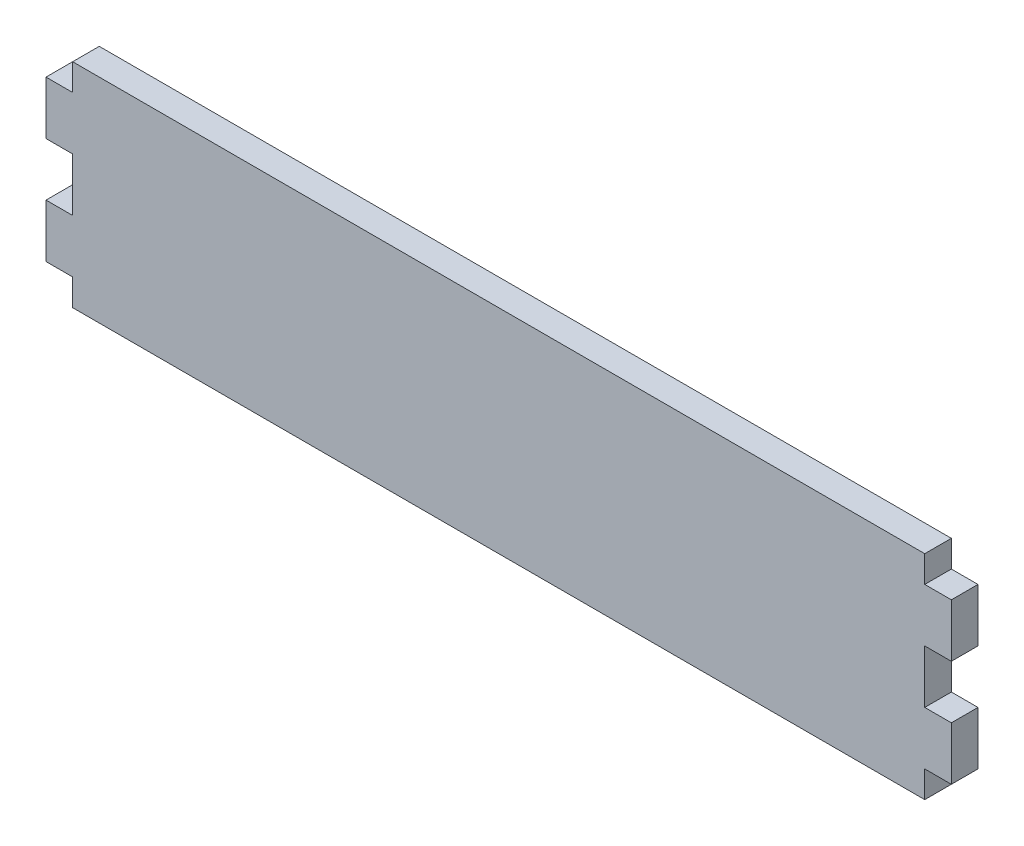
ISO-10303-21;
HEADER;
FILE_DESCRIPTION(('STEP AP214'),'2;1');
FILE_NAME('part.step','',(''),(''),'','','');
FILE_SCHEMA(('AUTOMOTIVE_DESIGN { 1 0 10303 214 1 1 1 1 }'));
ENDSEC;
DATA;
#1=APPLICATION_CONTEXT('core data for automotive mechanical design processes');
#2=APPLICATION_PROTOCOL_DEFINITION('international standard','automotive_design',2000,#1);
#3=PRODUCT_CONTEXT('',#1,'mechanical');
#4=PRODUCT('Part','Part','',(#3));
#5=PRODUCT_RELATED_PRODUCT_CATEGORY('part','',(#4));
#6=PRODUCT_DEFINITION_FORMATION('','',#4);
#7=PRODUCT_DEFINITION_CONTEXT('part definition',#1,'design');
#8=PRODUCT_DEFINITION('design','',#6,#7);
#9=PRODUCT_DEFINITION_SHAPE('','',#8);
#10=(LENGTH_UNIT() NAMED_UNIT(*) SI_UNIT(.MILLI.,.METRE.));
#11=(NAMED_UNIT(*) PLANE_ANGLE_UNIT() SI_UNIT($,.RADIAN.));
#12=(NAMED_UNIT(*) SI_UNIT($,.STERADIAN.) SOLID_ANGLE_UNIT());
#13=UNCERTAINTY_MEASURE_WITH_UNIT(LENGTH_MEASURE(1.E-05),#10,'distance_accuracy_value','');
#14=(GEOMETRIC_REPRESENTATION_CONTEXT(3) GLOBAL_UNCERTAINTY_ASSIGNED_CONTEXT((#13)) GLOBAL_UNIT_ASSIGNED_CONTEXT((#10,
#11,#12)) REPRESENTATION_CONTEXT('',''));
#15=CARTESIAN_POINT('',(0.,0.,0.));
#16=DIRECTION('',(0.,0.,1.));
#17=DIRECTION('',(1.,0.,0.));
#18=AXIS2_PLACEMENT_3D('',#15,#16,#17);
#19=CARTESIAN_POINT('',(40.,17.5,2.5));
#20=DIRECTION('',(-1.,0.,0.));
#21=DIRECTION('',(0.,0.,1.));
#22=AXIS2_PLACEMENT_3D('',#19,#20,#21);
#23=PLANE('',#22);
#24=DIRECTION('',(0.,1.,0.));
#25=VECTOR('',#24,1.);
#26=CARTESIAN_POINT('',(40.,17.5,0.));
#27=LINE('',#26,#25);
#28=CARTESIAN_POINT('',(40.,17.5,0.));
#29=VERTEX_POINT('',#28);
#30=CARTESIAN_POINT('',(40.,20.,0.));
#31=VERTEX_POINT('',#30);
#32=EDGE_CURVE('E201',#29,#31,#27,.T.);
#33=ORIENTED_EDGE('',*,*,#32,.T.);
#34=DIRECTION('',(0.,0.,-1.));
#35=VECTOR('',#34,1.);
#36=CARTESIAN_POINT('',(40.,20.,2.5));
#37=LINE('',#36,#35);
#38=CARTESIAN_POINT('',(40.,20.,2.5));
#39=VERTEX_POINT('',#38);
#40=EDGE_CURVE('E11',#39,#31,#37,.T.);
#41=ORIENTED_EDGE('',*,*,#40,.F.);
#42=DIRECTION('',(0.,1.,0.));
#43=VECTOR('',#42,1.);
#44=CARTESIAN_POINT('',(40.,17.5,2.5));
#45=LINE('',#44,#43);
#46=CARTESIAN_POINT('',(40.,17.5,2.5));
#47=VERTEX_POINT('',#46);
#48=EDGE_CURVE('E239',#47,#39,#45,.T.);
#49=ORIENTED_EDGE('',*,*,#48,.F.);
#50=DIRECTION('',(0.,0.,-1.));
#51=VECTOR('',#50,1.);
#52=CARTESIAN_POINT('',(40.,17.5,2.5));
#53=LINE('',#52,#51);
#54=EDGE_CURVE('E197',#47,#29,#53,.T.);
#55=ORIENTED_EDGE('',*,*,#54,.T.);
#56=EDGE_LOOP('',(#33,#41,#49,#55));
#57=FACE_BOUND('',#56,.T.);
#58=ADVANCED_FACE('F33',(#57),#23,.F.);
#59=CARTESIAN_POINT('',(-40.,20.,2.5));
#60=DIRECTION('',(0.,-1.,0.));
#61=DIRECTION('',(0.,0.,-1.));
#62=AXIS2_PLACEMENT_3D('',#59,#60,#61);
#63=PLANE('',#62);
#64=DIRECTION('',(-1.,0.,0.));
#65=VECTOR('',#64,1.);
#66=CARTESIAN_POINT('',(-40.,20.,0.));
#67=LINE('',#66,#65);
#68=CARTESIAN_POINT('',(-40.,20.,0.));
#69=VERTEX_POINT('',#68);
#70=EDGE_CURVE('E204',#31,#69,#67,.T.);
#71=ORIENTED_EDGE('',*,*,#70,.T.);
#72=DIRECTION('',(0.,0.,-1.));
#73=VECTOR('',#72,1.);
#74=CARTESIAN_POINT('',(-40.,20.,2.5));
#75=LINE('',#74,#73);
#76=CARTESIAN_POINT('',(-40.,20.,2.5));
#77=VERTEX_POINT('',#76);
#78=EDGE_CURVE('E41',#77,#69,#75,.T.);
#79=ORIENTED_EDGE('',*,*,#78,.F.);
#80=DIRECTION('',(-1.,0.,0.));
#81=VECTOR('',#80,1.);
#82=CARTESIAN_POINT('',(-40.,20.,2.5));
#83=LINE('',#82,#81);
#84=EDGE_CURVE('E128',#39,#77,#83,.T.);
#85=ORIENTED_EDGE('',*,*,#84,.F.);
#86=ORIENTED_EDGE('',*,*,#40,.T.);
#87=EDGE_LOOP('',(#71,#79,#85,#86));
#88=FACE_BOUND('',#87,.T.);
#89=ADVANCED_FACE('F357',(#88),#63,.F.);
#90=CARTESIAN_POINT('',(-40.,17.5,2.5));
#91=DIRECTION('',(1.,0.,0.));
#92=DIRECTION('',(0.,0.,-1.));
#93=AXIS2_PLACEMENT_3D('',#90,#91,#92);
#94=PLANE('',#93);
#95=DIRECTION('',(0.,-1.,0.));
#96=VECTOR('',#95,1.);
#97=CARTESIAN_POINT('',(-40.,17.5,0.));
#98=LINE('',#97,#96);
#99=CARTESIAN_POINT('',(-40.,17.5,0.));
#100=VERTEX_POINT('',#99);
#101=EDGE_CURVE('E206',#69,#100,#98,.T.);
#102=ORIENTED_EDGE('',*,*,#101,.T.);
#103=DIRECTION('',(0.,0.,-1.));
#104=VECTOR('',#103,1.);
#105=CARTESIAN_POINT('',(-40.,17.5,2.5));
#106=LINE('',#105,#104);
#107=CARTESIAN_POINT('',(-40.,17.5,2.5));
#108=VERTEX_POINT('',#107);
#109=EDGE_CURVE('E282',#108,#100,#106,.T.);
#110=ORIENTED_EDGE('',*,*,#109,.F.);
#111=DIRECTION('',(0.,-1.,0.));
#112=VECTOR('',#111,1.);
#113=CARTESIAN_POINT('',(-40.,17.5,2.5));
#114=LINE('',#113,#112);
#115=EDGE_CURVE('E290',#77,#108,#114,.T.);
#116=ORIENTED_EDGE('',*,*,#115,.F.);
#117=ORIENTED_EDGE('',*,*,#78,.T.);
#118=EDGE_LOOP('',(#102,#110,#116,#117));
#119=FACE_BOUND('',#118,.T.);
#120=ADVANCED_FACE('F288',(#119),#94,.F.);
#121=CARTESIAN_POINT('',(-40.,17.5,2.5));
#122=DIRECTION('',(0.,-1.,0.));
#123=DIRECTION('',(0.,0.,-1.));
#124=AXIS2_PLACEMENT_3D('',#121,#122,#123);
#125=PLANE('',#124);
#126=DIRECTION('',(-1.,0.,0.));
#127=VECTOR('',#126,1.);
#128=CARTESIAN_POINT('',(-40.,17.5,0.));
#129=LINE('',#128,#127);
#130=CARTESIAN_POINT('',(-42.5,17.5,0.));
#131=VERTEX_POINT('',#130);
#132=EDGE_CURVE('E208',#100,#131,#129,.T.);
#133=ORIENTED_EDGE('',*,*,#132,.T.);
#134=DIRECTION('',(0.,0.,-1.));
#135=VECTOR('',#134,1.);
#136=CARTESIAN_POINT('',(-42.5,17.5,2.5));
#137=LINE('',#136,#135);
#138=CARTESIAN_POINT('',(-42.5,17.5,2.5));
#139=VERTEX_POINT('',#138);
#140=EDGE_CURVE('E279',#139,#131,#137,.T.);
#141=ORIENTED_EDGE('',*,*,#140,.F.);
#142=DIRECTION('',(-1.,0.,0.));
#143=VECTOR('',#142,1.);
#144=CARTESIAN_POINT('',(-40.,17.5,2.5));
#145=LINE('',#144,#143);
#146=EDGE_CURVE('E308',#108,#139,#145,.T.);
#147=ORIENTED_EDGE('',*,*,#146,.F.);
#148=ORIENTED_EDGE('',*,*,#109,.T.);
#149=EDGE_LOOP('',(#133,#141,#147,#148));
#150=FACE_BOUND('',#149,.T.);
#151=ADVANCED_FACE('F299',(#150),#125,.F.);
#152=CARTESIAN_POINT('',(-42.5,17.5,2.5));
#153=DIRECTION('',(1.,0.,0.));
#154=DIRECTION('',(0.,0.,-1.));
#155=AXIS2_PLACEMENT_3D('',#152,#153,#154);
#156=PLANE('',#155);
#157=DIRECTION('',(0.,-1.,0.));
#158=VECTOR('',#157,1.);
#159=CARTESIAN_POINT('',(-42.5,17.5,0.));
#160=LINE('',#159,#158);
#161=CARTESIAN_POINT('',(-42.5,12.5,0.));
#162=VERTEX_POINT('',#161);
#163=EDGE_CURVE('E210',#131,#162,#160,.T.);
#164=ORIENTED_EDGE('',*,*,#163,.T.);
#165=DIRECTION('',(0.,0.,-1.));
#166=VECTOR('',#165,1.);
#167=CARTESIAN_POINT('',(-42.5,12.5,2.5));
#168=LINE('',#167,#166);
#169=CARTESIAN_POINT('',(-42.5,12.5,2.5));
#170=VERTEX_POINT('',#169);
#171=EDGE_CURVE('E276',#170,#162,#168,.T.);
#172=ORIENTED_EDGE('',*,*,#171,.F.);
#173=DIRECTION('',(0.,-1.,0.));
#174=VECTOR('',#173,1.);
#175=CARTESIAN_POINT('',(-42.5,17.5,2.5));
#176=LINE('',#175,#174);
#177=EDGE_CURVE('E305',#139,#170,#176,.T.);
#178=ORIENTED_EDGE('',*,*,#177,.F.);
#179=ORIENTED_EDGE('',*,*,#140,.T.);
#180=EDGE_LOOP('',(#164,#172,#178,#179));
#181=FACE_BOUND('',#180,.T.);
#182=ADVANCED_FACE('F303',(#181),#156,.F.);
#183=CARTESIAN_POINT('',(-40.,12.5,2.5));
#184=DIRECTION('',(0.,1.,0.));
#185=DIRECTION('',(0.,0.,1.));
#186=AXIS2_PLACEMENT_3D('',#183,#184,#185);
#187=PLANE('',#186);
#188=DIRECTION('',(1.,0.,0.));
#189=VECTOR('',#188,1.);
#190=CARTESIAN_POINT('',(-40.,12.5,0.));
#191=LINE('',#190,#189);
#192=CARTESIAN_POINT('',(-40.,12.5,0.));
#193=VERTEX_POINT('',#192);
#194=EDGE_CURVE('E212',#162,#193,#191,.T.);
#195=ORIENTED_EDGE('',*,*,#194,.T.);
#196=DIRECTION('',(0.,0.,-1.));
#197=VECTOR('',#196,1.);
#198=CARTESIAN_POINT('',(-40.,12.5,2.5));
#199=LINE('',#198,#197);
#200=CARTESIAN_POINT('',(-40.,12.5,2.5));
#201=VERTEX_POINT('',#200);
#202=EDGE_CURVE('E273',#201,#193,#199,.T.);
#203=ORIENTED_EDGE('',*,*,#202,.F.);
#204=DIRECTION('',(1.,0.,0.));
#205=VECTOR('',#204,1.);
#206=CARTESIAN_POINT('',(-40.,12.5,2.5));
#207=LINE('',#206,#205);
#208=EDGE_CURVE('E307',#170,#201,#207,.T.);
#209=ORIENTED_EDGE('',*,*,#208,.F.);
#210=ORIENTED_EDGE('',*,*,#171,.T.);
#211=EDGE_LOOP('',(#195,#203,#209,#210));
#212=FACE_BOUND('',#211,.T.);
#213=ADVANCED_FACE('F370',(#212),#187,.F.);
#214=CARTESIAN_POINT('',(-40.,7.5,2.5));
#215=DIRECTION('',(1.,0.,0.));
#216=DIRECTION('',(0.,0.,-1.));
#217=AXIS2_PLACEMENT_3D('',#214,#215,#216);
#218=PLANE('',#217);
#219=DIRECTION('',(0.,-1.,0.));
#220=VECTOR('',#219,1.);
#221=CARTESIAN_POINT('',(-40.,7.5,0.));
#222=LINE('',#221,#220);
#223=CARTESIAN_POINT('',(-40.,7.5,0.));
#224=VERTEX_POINT('',#223);
#225=EDGE_CURVE('E214',#193,#224,#222,.T.);
#226=ORIENTED_EDGE('',*,*,#225,.T.);
#227=DIRECTION('',(0.,0.,-1.));
#228=VECTOR('',#227,1.);
#229=CARTESIAN_POINT('',(-40.,7.5,2.5));
#230=LINE('',#229,#228);
#231=CARTESIAN_POINT('',(-40.,7.5,2.5));
#232=VERTEX_POINT('',#231);
#233=EDGE_CURVE('E270',#232,#224,#230,.T.);
#234=ORIENTED_EDGE('',*,*,#233,.F.);
#235=DIRECTION('',(0.,-1.,0.));
#236=VECTOR('',#235,1.);
#237=CARTESIAN_POINT('',(-40.,7.5,2.5));
#238=LINE('',#237,#236);
#239=EDGE_CURVE('E310',#201,#232,#238,.T.);
#240=ORIENTED_EDGE('',*,*,#239,.F.);
#241=ORIENTED_EDGE('',*,*,#202,.T.);
#242=EDGE_LOOP('',(#226,#234,#240,#241));
#243=FACE_BOUND('',#242,.T.);
#244=ADVANCED_FACE('F373',(#243),#218,.F.);
#245=CARTESIAN_POINT('',(-40.,7.5,2.5));
#246=DIRECTION('',(0.,-1.,0.));
#247=DIRECTION('',(0.,0.,-1.));
#248=AXIS2_PLACEMENT_3D('',#245,#246,#247);
#249=PLANE('',#248);
#250=DIRECTION('',(-1.,0.,0.));
#251=VECTOR('',#250,1.);
#252=CARTESIAN_POINT('',(-40.,7.5,0.));
#253=LINE('',#252,#251);
#254=CARTESIAN_POINT('',(-42.5,7.5,0.));
#255=VERTEX_POINT('',#254);
#256=EDGE_CURVE('E216',#224,#255,#253,.T.);
#257=ORIENTED_EDGE('',*,*,#256,.T.);
#258=DIRECTION('',(0.,0.,-1.));
#259=VECTOR('',#258,1.);
#260=CARTESIAN_POINT('',(-42.5,7.5,2.5));
#261=LINE('',#260,#259);
#262=CARTESIAN_POINT('',(-42.5,7.5,2.5));
#263=VERTEX_POINT('',#262);
#264=EDGE_CURVE('E267',#263,#255,#261,.T.);
#265=ORIENTED_EDGE('',*,*,#264,.F.);
#266=DIRECTION('',(-1.,0.,0.));
#267=VECTOR('',#266,1.);
#268=CARTESIAN_POINT('',(-40.,7.5,2.5));
#269=LINE('',#268,#267);
#270=EDGE_CURVE('E316',#232,#263,#269,.T.);
#271=ORIENTED_EDGE('',*,*,#270,.F.);
#272=ORIENTED_EDGE('',*,*,#233,.T.);
#273=EDGE_LOOP('',(#257,#265,#271,#272));
#274=FACE_BOUND('',#273,.T.);
#275=ADVANCED_FACE('F377',(#274),#249,.F.);
#276=CARTESIAN_POINT('',(-42.5,7.5,2.5));
#277=DIRECTION('',(1.,0.,0.));
#278=DIRECTION('',(0.,0.,-1.));
#279=AXIS2_PLACEMENT_3D('',#276,#277,#278);
#280=PLANE('',#279);
#281=DIRECTION('',(0.,-1.,0.));
#282=VECTOR('',#281,1.);
#283=CARTESIAN_POINT('',(-42.5,7.5,0.));
#284=LINE('',#283,#282);
#285=CARTESIAN_POINT('',(-42.5,2.5,0.));
#286=VERTEX_POINT('',#285);
#287=EDGE_CURVE('E218',#255,#286,#284,.T.);
#288=ORIENTED_EDGE('',*,*,#287,.T.);
#289=DIRECTION('',(0.,0.,-1.));
#290=VECTOR('',#289,1.);
#291=CARTESIAN_POINT('',(-42.5,2.5,2.5));
#292=LINE('',#291,#290);
#293=CARTESIAN_POINT('',(-42.5,2.5,2.5));
#294=VERTEX_POINT('',#293);
#295=EDGE_CURVE('E264',#294,#286,#292,.T.);
#296=ORIENTED_EDGE('',*,*,#295,.F.);
#297=DIRECTION('',(0.,-1.,0.));
#298=VECTOR('',#297,1.);
#299=CARTESIAN_POINT('',(-42.5,7.5,2.5));
#300=LINE('',#299,#298);
#301=EDGE_CURVE('E318',#263,#294,#300,.T.);
#302=ORIENTED_EDGE('',*,*,#301,.F.);
#303=ORIENTED_EDGE('',*,*,#264,.T.);
#304=EDGE_LOOP('',(#288,#296,#302,#303));
#305=FACE_BOUND('',#304,.T.);
#306=ADVANCED_FACE('F381',(#305),#280,.F.);
#307=CARTESIAN_POINT('',(-40.,2.5,2.5));
#308=DIRECTION('',(0.,1.,0.));
#309=DIRECTION('',(-1.,0.,0.));
#310=AXIS2_PLACEMENT_3D('',#307,#308,#309);
#311=PLANE('',#310);
#312=DIRECTION('',(1.,0.,0.));
#313=VECTOR('',#312,1.);
#314=CARTESIAN_POINT('',(-40.,2.5,0.));
#315=LINE('',#314,#313);
#316=CARTESIAN_POINT('',(-40.,2.5,0.));
#317=VERTEX_POINT('',#316);
#318=EDGE_CURVE('E220',#286,#317,#315,.T.);
#319=ORIENTED_EDGE('',*,*,#318,.T.);
#320=DIRECTION('',(0.,0.,-1.));
#321=VECTOR('',#320,1.);
#322=CARTESIAN_POINT('',(-40.,2.5,2.5));
#323=LINE('',#322,#321);
#324=CARTESIAN_POINT('',(-40.,2.5,2.5));
#325=VERTEX_POINT('',#324);
#326=EDGE_CURVE('E261',#325,#317,#323,.T.);
#327=ORIENTED_EDGE('',*,*,#326,.F.);
#328=DIRECTION('',(1.,0.,0.));
#329=VECTOR('',#328,1.);
#330=CARTESIAN_POINT('',(-40.,2.5,2.5));
#331=LINE('',#330,#329);
#332=EDGE_CURVE('E320',#294,#325,#331,.T.);
#333=ORIENTED_EDGE('',*,*,#332,.F.);
#334=ORIENTED_EDGE('',*,*,#295,.T.);
#335=EDGE_LOOP('',(#319,#327,#333,#334));
#336=FACE_BOUND('',#335,.T.);
#337=ADVANCED_FACE('F385',(#336),#311,.F.);
#338=CARTESIAN_POINT('',(-40.,0.,2.5));
#339=DIRECTION('',(1.,0.,0.));
#340=DIRECTION('',(0.,0.,-1.));
#341=AXIS2_PLACEMENT_3D('',#338,#339,#340);
#342=PLANE('',#341);
#343=DIRECTION('',(0.,-1.,0.));
#344=VECTOR('',#343,1.);
#345=CARTESIAN_POINT('',(-40.,0.,0.));
#346=LINE('',#345,#344);
#347=CARTESIAN_POINT('',(-40.,0.,0.));
#348=VERTEX_POINT('',#347);
#349=EDGE_CURVE('E222',#317,#348,#346,.T.);
#350=ORIENTED_EDGE('',*,*,#349,.T.);
#351=DIRECTION('',(0.,0.,-1.));
#352=VECTOR('',#351,1.);
#353=CARTESIAN_POINT('',(-40.,0.,2.5));
#354=LINE('',#353,#352);
#355=CARTESIAN_POINT('',(-40.,0.,2.5));
#356=VERTEX_POINT('',#355);
#357=EDGE_CURVE('E258',#356,#348,#354,.T.);
#358=ORIENTED_EDGE('',*,*,#357,.F.);
#359=DIRECTION('',(0.,-1.,0.));
#360=VECTOR('',#359,1.);
#361=CARTESIAN_POINT('',(-40.,0.,2.5));
#362=LINE('',#361,#360);
#363=EDGE_CURVE('E322',#325,#356,#362,.T.);
#364=ORIENTED_EDGE('',*,*,#363,.F.);
#365=ORIENTED_EDGE('',*,*,#326,.T.);
#366=EDGE_LOOP('',(#350,#358,#364,#365));
#367=FACE_BOUND('',#366,.T.);
#368=ADVANCED_FACE('F389',(#367),#342,.F.);
#369=CARTESIAN_POINT('',(-40.,0.,2.5));
#370=DIRECTION('',(0.,1.,0.));
#371=DIRECTION('',(0.,0.,1.));
#372=AXIS2_PLACEMENT_3D('',#369,#370,#371);
#373=PLANE('',#372);
#374=DIRECTION('',(1.,0.,0.));
#375=VECTOR('',#374,1.);
#376=CARTESIAN_POINT('',(-40.,0.,0.));
#377=LINE('',#376,#375);
#378=CARTESIAN_POINT('',(40.,0.,0.));
#379=VERTEX_POINT('',#378);
#380=EDGE_CURVE('E224',#348,#379,#377,.T.);
#381=ORIENTED_EDGE('',*,*,#380,.T.);
#382=DIRECTION('',(0.,0.,-1.));
#383=VECTOR('',#382,1.);
#384=CARTESIAN_POINT('',(40.,0.,2.5));
#385=LINE('',#384,#383);
#386=CARTESIAN_POINT('',(40.,0.,2.5));
#387=VERTEX_POINT('',#386);
#388=EDGE_CURVE('E255',#387,#379,#385,.T.);
#389=ORIENTED_EDGE('',*,*,#388,.F.);
#390=DIRECTION('',(1.,0.,0.));
#391=VECTOR('',#390,1.);
#392=CARTESIAN_POINT('',(-40.,0.,2.5));
#393=LINE('',#392,#391);
#394=EDGE_CURVE('E324',#356,#387,#393,.T.);
#395=ORIENTED_EDGE('',*,*,#394,.F.);
#396=ORIENTED_EDGE('',*,*,#357,.T.);
#397=EDGE_LOOP('',(#381,#389,#395,#396));
#398=FACE_BOUND('',#397,.T.);
#399=ADVANCED_FACE('F393',(#398),#373,.F.);
#400=CARTESIAN_POINT('',(40.,0.,2.5));
#401=DIRECTION('',(-1.,0.,0.));
#402=DIRECTION('',(0.,0.,1.));
#403=AXIS2_PLACEMENT_3D('',#400,#401,#402);
#404=PLANE('',#403);
#405=DIRECTION('',(0.,1.,0.));
#406=VECTOR('',#405,1.);
#407=CARTESIAN_POINT('',(40.,0.,0.));
#408=LINE('',#407,#406);
#409=CARTESIAN_POINT('',(40.,2.5,0.));
#410=VERTEX_POINT('',#409);
#411=EDGE_CURVE('E226',#379,#410,#408,.T.);
#412=ORIENTED_EDGE('',*,*,#411,.T.);
#413=DIRECTION('',(0.,0.,-1.));
#414=VECTOR('',#413,1.);
#415=CARTESIAN_POINT('',(40.,2.5,2.5));
#416=LINE('',#415,#414);
#417=CARTESIAN_POINT('',(40.,2.5,2.5));
#418=VERTEX_POINT('',#417);
#419=EDGE_CURVE('E252',#418,#410,#416,.T.);
#420=ORIENTED_EDGE('',*,*,#419,.F.);
#421=DIRECTION('',(0.,1.,0.));
#422=VECTOR('',#421,1.);
#423=CARTESIAN_POINT('',(40.,0.,2.5));
#424=LINE('',#423,#422);
#425=EDGE_CURVE('E326',#387,#418,#424,.T.);
#426=ORIENTED_EDGE('',*,*,#425,.F.);
#427=ORIENTED_EDGE('',*,*,#388,.T.);
#428=EDGE_LOOP('',(#412,#420,#426,#427));
#429=FACE_BOUND('',#428,.T.);
#430=ADVANCED_FACE('F397',(#429),#404,.F.);
#431=CARTESIAN_POINT('',(40.,2.5,2.5));
#432=DIRECTION('',(0.,1.,0.));
#433=DIRECTION('',(-1.,0.,0.));
#434=AXIS2_PLACEMENT_3D('',#431,#432,#433);
#435=PLANE('',#434);
#436=DIRECTION('',(1.,0.,0.));
#437=VECTOR('',#436,1.);
#438=CARTESIAN_POINT('',(40.,2.5,0.));
#439=LINE('',#438,#437);
#440=CARTESIAN_POINT('',(42.5,2.5,0.));
#441=VERTEX_POINT('',#440);
#442=EDGE_CURVE('E228',#410,#441,#439,.T.);
#443=ORIENTED_EDGE('',*,*,#442,.T.);
#444=DIRECTION('',(0.,0.,-1.));
#445=VECTOR('',#444,1.);
#446=CARTESIAN_POINT('',(42.5,2.5,2.5));
#447=LINE('',#446,#445);
#448=CARTESIAN_POINT('',(42.5,2.5,2.5));
#449=VERTEX_POINT('',#448);
#450=EDGE_CURVE('E249',#449,#441,#447,.T.);
#451=ORIENTED_EDGE('',*,*,#450,.F.);
#452=DIRECTION('',(1.,0.,0.));
#453=VECTOR('',#452,1.);
#454=CARTESIAN_POINT('',(40.,2.5,2.5));
#455=LINE('',#454,#453);
#456=EDGE_CURVE('E328',#418,#449,#455,.T.);
#457=ORIENTED_EDGE('',*,*,#456,.F.);
#458=ORIENTED_EDGE('',*,*,#419,.T.);
#459=EDGE_LOOP('',(#443,#451,#457,#458));
#460=FACE_BOUND('',#459,.T.);
#461=ADVANCED_FACE('F401',(#460),#435,.F.);
#462=CARTESIAN_POINT('',(42.5,7.5,2.5));
#463=DIRECTION('',(-1.,0.,0.));
#464=DIRECTION('',(0.,0.,1.));
#465=AXIS2_PLACEMENT_3D('',#462,#463,#464);
#466=PLANE('',#465);
#467=DIRECTION('',(0.,1.,0.));
#468=VECTOR('',#467,1.);
#469=CARTESIAN_POINT('',(42.5,7.5,0.));
#470=LINE('',#469,#468);
#471=CARTESIAN_POINT('',(42.5,7.5,0.));
#472=VERTEX_POINT('',#471);
#473=EDGE_CURVE('E230',#441,#472,#470,.T.);
#474=ORIENTED_EDGE('',*,*,#473,.T.);
#475=DIRECTION('',(0.,0.,-1.));
#476=VECTOR('',#475,1.);
#477=CARTESIAN_POINT('',(42.5,7.5,2.5));
#478=LINE('',#477,#476);
#479=CARTESIAN_POINT('',(42.5,7.5,2.5));
#480=VERTEX_POINT('',#479);
#481=EDGE_CURVE('E246',#480,#472,#478,.T.);
#482=ORIENTED_EDGE('',*,*,#481,.F.);
#483=DIRECTION('',(0.,1.,0.));
#484=VECTOR('',#483,1.);
#485=CARTESIAN_POINT('',(42.5,7.5,2.5));
#486=LINE('',#485,#484);
#487=EDGE_CURVE('E330',#449,#480,#486,.T.);
#488=ORIENTED_EDGE('',*,*,#487,.F.);
#489=ORIENTED_EDGE('',*,*,#450,.T.);
#490=EDGE_LOOP('',(#474,#482,#488,#489));
#491=FACE_BOUND('',#490,.T.);
#492=ADVANCED_FACE('F405',(#491),#466,.F.);
#493=CARTESIAN_POINT('',(40.,7.5,2.5));
#494=DIRECTION('',(0.,-1.,0.));
#495=DIRECTION('',(0.,0.,-1.));
#496=AXIS2_PLACEMENT_3D('',#493,#494,#495);
#497=PLANE('',#496);
#498=DIRECTION('',(-1.,0.,0.));
#499=VECTOR('',#498,1.);
#500=CARTESIAN_POINT('',(40.,7.5,0.));
#501=LINE('',#500,#499);
#502=CARTESIAN_POINT('',(40.,7.5,0.));
#503=VERTEX_POINT('',#502);
#504=EDGE_CURVE('E232',#472,#503,#501,.T.);
#505=ORIENTED_EDGE('',*,*,#504,.T.);
#506=DIRECTION('',(0.,0.,-1.));
#507=VECTOR('',#506,1.);
#508=CARTESIAN_POINT('',(40.,7.5,2.5));
#509=LINE('',#508,#507);
#510=CARTESIAN_POINT('',(40.,7.5,2.5));
#511=VERTEX_POINT('',#510);
#512=EDGE_CURVE('E243',#511,#503,#509,.T.);
#513=ORIENTED_EDGE('',*,*,#512,.F.);
#514=DIRECTION('',(-1.,0.,0.));
#515=VECTOR('',#514,1.);
#516=CARTESIAN_POINT('',(40.,7.5,2.5));
#517=LINE('',#516,#515);
#518=EDGE_CURVE('E332',#480,#511,#517,.T.);
#519=ORIENTED_EDGE('',*,*,#518,.F.);
#520=ORIENTED_EDGE('',*,*,#481,.T.);
#521=EDGE_LOOP('',(#505,#513,#519,#520));
#522=FACE_BOUND('',#521,.T.);
#523=ADVANCED_FACE('F338',(#522),#497,.F.);
#524=CARTESIAN_POINT('',(40.,7.5,2.5));
#525=DIRECTION('',(-1.,0.,0.));
#526=DIRECTION('',(0.,0.,1.));
#527=AXIS2_PLACEMENT_3D('',#524,#525,#526);
#528=PLANE('',#527);
#529=DIRECTION('',(0.,1.,0.));
#530=VECTOR('',#529,1.);
#531=CARTESIAN_POINT('',(40.,7.5,0.));
#532=LINE('',#531,#530);
#533=CARTESIAN_POINT('',(40.,12.5,0.));
#534=VERTEX_POINT('',#533);
#535=EDGE_CURVE('E234',#503,#534,#532,.T.);
#536=ORIENTED_EDGE('',*,*,#535,.T.);
#537=DIRECTION('',(0.,0.,-1.));
#538=VECTOR('',#537,1.);
#539=CARTESIAN_POINT('',(40.,12.5,2.5));
#540=LINE('',#539,#538);
#541=CARTESIAN_POINT('',(40.,12.5,2.5));
#542=VERTEX_POINT('',#541);
#543=EDGE_CURVE('E192',#542,#534,#540,.T.);
#544=ORIENTED_EDGE('',*,*,#543,.F.);
#545=DIRECTION('',(0.,1.,0.));
#546=VECTOR('',#545,1.);
#547=CARTESIAN_POINT('',(40.,7.5,2.5));
#548=LINE('',#547,#546);
#549=EDGE_CURVE('E183',#511,#542,#548,.T.);
#550=ORIENTED_EDGE('',*,*,#549,.F.);
#551=ORIENTED_EDGE('',*,*,#512,.T.);
#552=EDGE_LOOP('',(#536,#544,#550,#551));
#553=FACE_BOUND('',#552,.T.);
#554=ADVANCED_FACE('F342',(#553),#528,.F.);
#555=CARTESIAN_POINT('',(40.,12.5,2.5));
#556=DIRECTION('',(0.,1.,0.));
#557=DIRECTION('',(0.,0.,1.));
#558=AXIS2_PLACEMENT_3D('',#555,#556,#557);
#559=PLANE('',#558);
#560=DIRECTION('',(1.,0.,0.));
#561=VECTOR('',#560,1.);
#562=CARTESIAN_POINT('',(40.,12.5,0.));
#563=LINE('',#562,#561);
#564=CARTESIAN_POINT('',(42.5,12.5,0.));
#565=VERTEX_POINT('',#564);
#566=EDGE_CURVE('E191',#534,#565,#563,.T.);
#567=ORIENTED_EDGE('',*,*,#566,.T.);
#568=DIRECTION('',(0.,0.,-1.));
#569=VECTOR('',#568,1.);
#570=CARTESIAN_POINT('',(42.5,12.5,2.5));
#571=LINE('',#570,#569);
#572=CARTESIAN_POINT('',(42.5,12.5,2.5));
#573=VERTEX_POINT('',#572);
#574=EDGE_CURVE('E188',#573,#565,#571,.T.);
#575=ORIENTED_EDGE('',*,*,#574,.F.);
#576=DIRECTION('',(1.,0.,0.));
#577=VECTOR('',#576,1.);
#578=CARTESIAN_POINT('',(40.,12.5,2.5));
#579=LINE('',#578,#577);
#580=EDGE_CURVE('E177',#542,#573,#579,.T.);
#581=ORIENTED_EDGE('',*,*,#580,.F.);
#582=ORIENTED_EDGE('',*,*,#543,.T.);
#583=EDGE_LOOP('',(#567,#575,#581,#582));
#584=FACE_BOUND('',#583,.T.);
#585=ADVANCED_FACE('F189',(#584),#559,.F.);
#586=CARTESIAN_POINT('',(42.5,17.5,2.5));
#587=DIRECTION('',(-1.,0.,0.));
#588=DIRECTION('',(0.,0.,1.));
#589=AXIS2_PLACEMENT_3D('',#586,#587,#588);
#590=PLANE('',#589);
#591=DIRECTION('',(0.,1.,0.));
#592=VECTOR('',#591,1.);
#593=CARTESIAN_POINT('',(42.5,17.5,0.));
#594=LINE('',#593,#592);
#595=CARTESIAN_POINT('',(42.5,17.5,0.));
#596=VERTEX_POINT('',#595);
#597=EDGE_CURVE('E114',#565,#596,#594,.T.);
#598=ORIENTED_EDGE('',*,*,#597,.T.);
#599=DIRECTION('',(0.,0.,-1.));
#600=VECTOR('',#599,1.);
#601=CARTESIAN_POINT('',(42.5,17.5,2.5));
#602=LINE('',#601,#600);
#603=CARTESIAN_POINT('',(42.5,17.5,2.5));
#604=VERTEX_POINT('',#603);
#605=EDGE_CURVE('E193',#604,#596,#602,.T.);
#606=ORIENTED_EDGE('',*,*,#605,.F.);
#607=DIRECTION('',(0.,1.,0.));
#608=VECTOR('',#607,1.);
#609=CARTESIAN_POINT('',(42.5,17.5,2.5));
#610=LINE('',#609,#608);
#611=EDGE_CURVE('E181',#573,#604,#610,.T.);
#612=ORIENTED_EDGE('',*,*,#611,.F.);
#613=ORIENTED_EDGE('',*,*,#574,.T.);
#614=EDGE_LOOP('',(#598,#606,#612,#613));
#615=FACE_BOUND('',#614,.T.);
#616=ADVANCED_FACE('F195',(#615),#590,.F.);
#617=CARTESIAN_POINT('',(40.,17.5,2.5));
#618=DIRECTION('',(0.,-1.,0.));
#619=DIRECTION('',(0.,0.,-1.));
#620=AXIS2_PLACEMENT_3D('',#617,#618,#619);
#621=PLANE('',#620);
#622=DIRECTION('',(-1.,0.,0.));
#623=VECTOR('',#622,1.);
#624=CARTESIAN_POINT('',(40.,17.5,0.));
#625=LINE('',#624,#623);
#626=EDGE_CURVE('E120',#596,#29,#625,.T.);
#627=ORIENTED_EDGE('',*,*,#626,.T.);
#628=ORIENTED_EDGE('',*,*,#54,.F.);
#629=DIRECTION('',(-1.,0.,0.));
#630=VECTOR('',#629,1.);
#631=CARTESIAN_POINT('',(40.,17.5,2.5));
#632=LINE('',#631,#630);
#633=EDGE_CURVE('E49',#604,#47,#632,.T.);
#634=ORIENTED_EDGE('',*,*,#633,.F.);
#635=ORIENTED_EDGE('',*,*,#605,.T.);
#636=EDGE_LOOP('',(#627,#628,#634,#635));
#637=FACE_BOUND('',#636,.T.);
#638=ADVANCED_FACE('F346',(#637),#621,.F.);
#639=CARTESIAN_POINT('',(0.,0.,2.5));
#640=DIRECTION('',(0.,0.,-1.));
#641=DIRECTION('',(-1.,0.,0.));
#642=AXIS2_PLACEMENT_3D('',#639,#640,#641);
#643=PLANE('',#642);
#644=ORIENTED_EDGE('',*,*,#48,.T.);
#645=ORIENTED_EDGE('',*,*,#84,.T.);
#646=ORIENTED_EDGE('',*,*,#115,.T.);
#647=ORIENTED_EDGE('',*,*,#146,.T.);
#648=ORIENTED_EDGE('',*,*,#177,.T.);
#649=ORIENTED_EDGE('',*,*,#208,.T.);
#650=ORIENTED_EDGE('',*,*,#239,.T.);
#651=ORIENTED_EDGE('',*,*,#270,.T.);
#652=ORIENTED_EDGE('',*,*,#301,.T.);
#653=ORIENTED_EDGE('',*,*,#332,.T.);
#654=ORIENTED_EDGE('',*,*,#363,.T.);
#655=ORIENTED_EDGE('',*,*,#394,.T.);
#656=ORIENTED_EDGE('',*,*,#425,.T.);
#657=ORIENTED_EDGE('',*,*,#456,.T.);
#658=ORIENTED_EDGE('',*,*,#487,.T.);
#659=ORIENTED_EDGE('',*,*,#518,.T.);
#660=ORIENTED_EDGE('',*,*,#549,.T.);
#661=ORIENTED_EDGE('',*,*,#580,.T.);
#662=ORIENTED_EDGE('',*,*,#611,.T.);
#663=ORIENTED_EDGE('',*,*,#633,.T.);
#664=EDGE_LOOP('',(#644,#645,#646,#647,#648,#649,#650,#651,#652,#653,#654,#655,#656,#657,#658,
#659,#660,#661,#662,#663));
#665=FACE_BOUND('',#664,.T.);
#666=ADVANCED_FACE('F179',(#665),#643,.F.);
#667=CARTESIAN_POINT('',(0.,0.,0.));
#668=DIRECTION('',(0.,0.,-1.));
#669=DIRECTION('',(-1.,0.,0.));
#670=AXIS2_PLACEMENT_3D('',#667,#668,#669);
#671=PLANE('',#670);
#672=ORIENTED_EDGE('',*,*,#32,.F.);
#673=ORIENTED_EDGE('',*,*,#626,.F.);
#674=ORIENTED_EDGE('',*,*,#597,.F.);
#675=ORIENTED_EDGE('',*,*,#566,.F.);
#676=ORIENTED_EDGE('',*,*,#535,.F.);
#677=ORIENTED_EDGE('',*,*,#504,.F.);
#678=ORIENTED_EDGE('',*,*,#473,.F.);
#679=ORIENTED_EDGE('',*,*,#442,.F.);
#680=ORIENTED_EDGE('',*,*,#411,.F.);
#681=ORIENTED_EDGE('',*,*,#380,.F.);
#682=ORIENTED_EDGE('',*,*,#349,.F.);
#683=ORIENTED_EDGE('',*,*,#318,.F.);
#684=ORIENTED_EDGE('',*,*,#287,.F.);
#685=ORIENTED_EDGE('',*,*,#256,.F.);
#686=ORIENTED_EDGE('',*,*,#225,.F.);
#687=ORIENTED_EDGE('',*,*,#194,.F.);
#688=ORIENTED_EDGE('',*,*,#163,.F.);
#689=ORIENTED_EDGE('',*,*,#132,.F.);
#690=ORIENTED_EDGE('',*,*,#101,.F.);
#691=ORIENTED_EDGE('',*,*,#70,.F.);
#692=EDGE_LOOP('',(#672,#673,#674,#675,#676,#677,#678,#679,#680,#681,#682,#683,#684,#685,#686,
#687,#688,#689,#690,#691));
#693=FACE_BOUND('',#692,.T.);
#694=ADVANCED_FACE('F294',(#693),#671,.T.);
#695=CLOSED_SHELL('',(#58,#89,#120,#151,#182,#213,#244,#275,#306,#337,#368,#399,#430,#461,#492,
#523,#554,#585,#616,#638,#666,#694));
#696=MANIFOLD_SOLID_BREP('B2',#695);
#697=ADVANCED_BREP_SHAPE_REPRESENTATION('',(#18,#696),#14);
#698=SHAPE_DEFINITION_REPRESENTATION(#9,#697);
ENDSEC;
END-ISO-10303-21;
